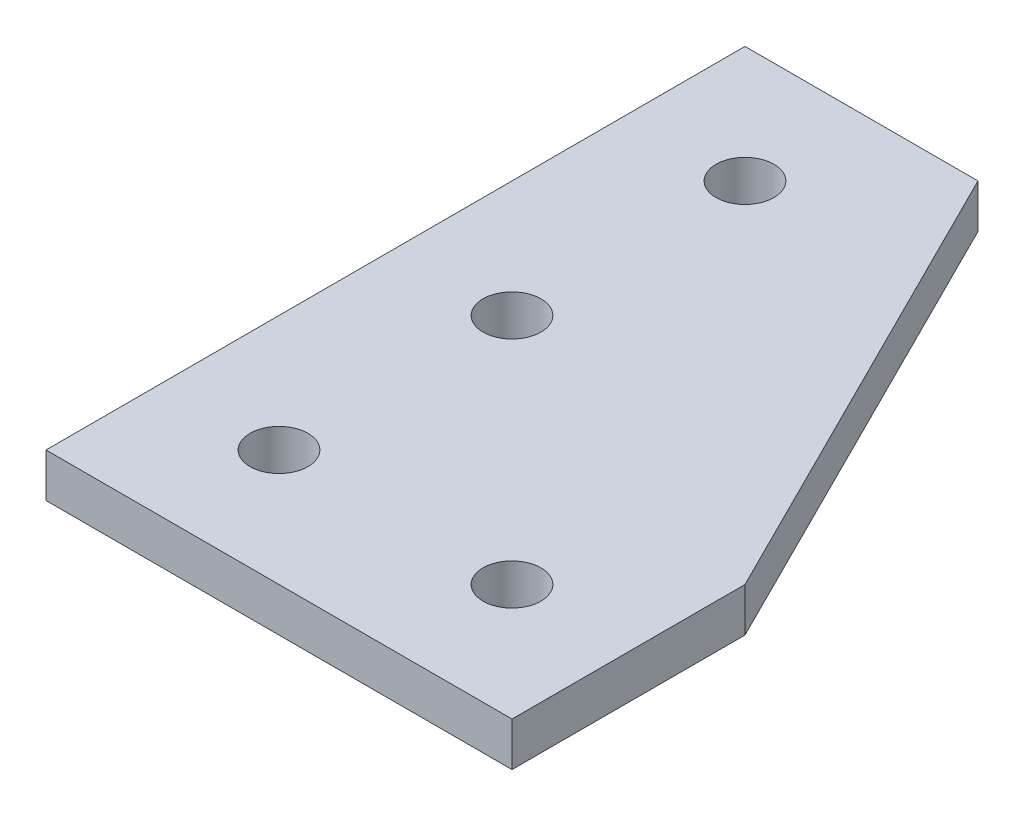
ISO-10303-21;
HEADER;
FILE_DESCRIPTION(('STEP AP214'),'2;1');
FILE_NAME('part.step','',(''),(''),'','','');
FILE_SCHEMA(('AUTOMOTIVE_DESIGN { 1 0 10303 214 1 1 1 1 }'));
ENDSEC;
DATA;
#1=APPLICATION_CONTEXT('core data for automotive mechanical design processes');
#2=APPLICATION_PROTOCOL_DEFINITION('international standard','automotive_design',2000,#1);
#3=PRODUCT_CONTEXT('',#1,'mechanical');
#4=PRODUCT('Part','Part','',(#3));
#5=PRODUCT_RELATED_PRODUCT_CATEGORY('part','',(#4));
#6=PRODUCT_DEFINITION_FORMATION('','',#4);
#7=PRODUCT_DEFINITION_CONTEXT('part definition',#1,'design');
#8=PRODUCT_DEFINITION('design','',#6,#7);
#9=PRODUCT_DEFINITION_SHAPE('','',#8);
#10=(LENGTH_UNIT() NAMED_UNIT(*) SI_UNIT(.MILLI.,.METRE.));
#11=(NAMED_UNIT(*) PLANE_ANGLE_UNIT() SI_UNIT($,.RADIAN.));
#12=(NAMED_UNIT(*) SI_UNIT($,.STERADIAN.) SOLID_ANGLE_UNIT());
#13=UNCERTAINTY_MEASURE_WITH_UNIT(LENGTH_MEASURE(1.E-05),#10,'distance_accuracy_value','');
#14=(GEOMETRIC_REPRESENTATION_CONTEXT(3) GLOBAL_UNCERTAINTY_ASSIGNED_CONTEXT((#13)) GLOBAL_UNIT_ASSIGNED_CONTEXT((#10,
#11,#12)) REPRESENTATION_CONTEXT('',''));
#15=CARTESIAN_POINT('',(0.,0.,0.));
#16=DIRECTION('',(0.,0.,1.));
#17=DIRECTION('',(1.,0.,0.));
#18=AXIS2_PLACEMENT_3D('',#15,#16,#17);
#19=CARTESIAN_POINT('',(25.4,-2.3876,38.1));
#20=DIRECTION('',(-1.,0.,0.));
#21=DIRECTION('',(0.,0.,1.));
#22=AXIS2_PLACEMENT_3D('',#19,#20,#21);
#23=PLANE('',#22);
#24=DIRECTION('',(0.,0.,-1.));
#25=VECTOR('',#24,1.);
#26=CARTESIAN_POINT('',(25.4,-2.3876,38.1));
#27=LINE('',#26,#25);
#28=CARTESIAN_POINT('',(25.4,-2.3876,38.1));
#29=VERTEX_POINT('',#28);
#30=CARTESIAN_POINT('',(25.4,-2.3876,12.7));
#31=VERTEX_POINT('',#30);
#32=EDGE_CURVE('E116',#29,#31,#27,.T.);
#33=ORIENTED_EDGE('',*,*,#32,.T.);
#34=DIRECTION('',(0.,1.,0.));
#35=VECTOR('',#34,1.);
#36=CARTESIAN_POINT('',(25.4,-5.2324,12.7));
#37=LINE('',#36,#35);
#38=CARTESIAN_POINT('',(25.4,2.3876,12.7));
#39=VERTEX_POINT('',#38);
#40=EDGE_CURVE('E103',#31,#39,#37,.T.);
#41=ORIENTED_EDGE('',*,*,#40,.T.);
#42=DIRECTION('',(0.,0.,-1.));
#43=VECTOR('',#42,1.);
#44=CARTESIAN_POINT('',(25.4,2.3876,38.1));
#45=LINE('',#44,#43);
#46=CARTESIAN_POINT('',(25.4,2.3876,38.1));
#47=VERTEX_POINT('',#46);
#48=EDGE_CURVE('E97',#47,#39,#45,.T.);
#49=ORIENTED_EDGE('',*,*,#48,.F.);
#50=DIRECTION('',(0.,1.,0.));
#51=VECTOR('',#50,1.);
#52=CARTESIAN_POINT('',(25.4,-2.3876,38.1));
#53=LINE('',#52,#51);
#54=EDGE_CURVE('E115',#29,#47,#53,.T.);
#55=ORIENTED_EDGE('',*,*,#54,.F.);
#56=EDGE_LOOP('',(#33,#41,#49,#55));
#57=FACE_BOUND('',#56,.T.);
#58=ADVANCED_FACE('F32',(#57),#23,.F.);
#59=CARTESIAN_POINT('',(-25.4,2.3876,38.1));
#60=DIRECTION('',(0.,-1.,0.));
#61=DIRECTION('',(0.,0.,-1.));
#62=AXIS2_PLACEMENT_3D('',#59,#60,#61);
#63=PLANE('',#62);
#64=CARTESIAN_POINT('',(-12.7,2.3876,0.));
#65=DIRECTION('',(0.,1.,0.));
#66=DIRECTION('',(0.,0.,1.));
#67=AXIS2_PLACEMENT_3D('',#64,#65,#66);
#68=CIRCLE('',#67,3.15188215806117);
#69=CARTESIAN_POINT('',(-12.7,2.3876,3.15188215806117));
#70=VERTEX_POINT('',#69);
#71=EDGE_CURVE('E189',#70,#70,#68,.T.);
#72=ORIENTED_EDGE('',*,*,#71,.F.);
#73=EDGE_LOOP('',(#72));
#74=FACE_BOUND('',#73,.T.);
#75=CARTESIAN_POINT('',(-12.7,2.3876,-25.4));
#76=DIRECTION('',(0.,1.,0.));
#77=DIRECTION('',(0.,0.,1.));
#78=AXIS2_PLACEMENT_3D('',#75,#76,#77);
#79=CIRCLE('',#78,3.15188215806117);
#80=CARTESIAN_POINT('',(-12.7,2.3876,-22.2481178419388));
#81=VERTEX_POINT('',#80);
#82=EDGE_CURVE('E188',#81,#81,#79,.T.);
#83=ORIENTED_EDGE('',*,*,#82,.F.);
#84=EDGE_LOOP('',(#83));
#85=FACE_BOUND('',#84,.T.);
#86=ORIENTED_EDGE('',*,*,#48,.T.);
#87=DIRECTION('',(0.447213595499958,0.,0.894427190999916));
#88=VECTOR('',#87,1.);
#89=CARTESIAN_POINT('',(0.,2.3876,-38.1));
#90=LINE('',#89,#88);
#91=CARTESIAN_POINT('',(0.,2.3876,-38.1));
#92=VERTEX_POINT('',#91);
#93=EDGE_CURVE('E90',#92,#39,#90,.T.);
#94=ORIENTED_EDGE('',*,*,#93,.F.);
#95=DIRECTION('',(-1.,0.,0.));
#96=VECTOR('',#95,1.);
#97=CARTESIAN_POINT('',(-25.4,2.3876,-38.1));
#98=LINE('',#97,#96);
#99=CARTESIAN_POINT('',(-25.4,2.3876,-38.1));
#100=VERTEX_POINT('',#99);
#101=EDGE_CURVE('E101',#92,#100,#98,.T.);
#102=ORIENTED_EDGE('',*,*,#101,.T.);
#103=DIRECTION('',(0.,0.,-1.));
#104=VECTOR('',#103,1.);
#105=CARTESIAN_POINT('',(-25.4,2.3876,38.1));
#106=LINE('',#105,#104);
#107=CARTESIAN_POINT('',(-25.4,2.3876,38.1));
#108=VERTEX_POINT('',#107);
#109=EDGE_CURVE('E121',#108,#100,#106,.T.);
#110=ORIENTED_EDGE('',*,*,#109,.F.);
#111=DIRECTION('',(-1.,0.,0.));
#112=VECTOR('',#111,1.);
#113=CARTESIAN_POINT('',(-25.4,2.3876,38.1));
#114=LINE('',#113,#112);
#115=EDGE_CURVE('E80',#47,#108,#114,.T.);
#116=ORIENTED_EDGE('',*,*,#115,.F.);
#117=EDGE_LOOP('',(#86,#94,#102,#110,#116));
#118=FACE_BOUND('',#117,.T.);
#119=CARTESIAN_POINT('',(-12.7,2.3876,25.4));
#120=DIRECTION('',(0.,1.,0.));
#121=DIRECTION('',(0.,0.,1.));
#122=AXIS2_PLACEMENT_3D('',#119,#120,#121);
#123=CIRCLE('',#122,3.15188215806117);
#124=CARTESIAN_POINT('',(-12.7,2.3876,28.5518821580612));
#125=VERTEX_POINT('',#124);
#126=EDGE_CURVE('E126',#125,#125,#123,.T.);
#127=ORIENTED_EDGE('',*,*,#126,.F.);
#128=EDGE_LOOP('',(#127));
#129=FACE_BOUND('',#128,.T.);
#130=CARTESIAN_POINT('',(12.7,2.3876,25.4));
#131=DIRECTION('',(0.,1.,0.));
#132=DIRECTION('',(0.,0.,1.));
#133=AXIS2_PLACEMENT_3D('',#130,#131,#132);
#134=CIRCLE('',#133,3.15188215806117);
#135=CARTESIAN_POINT('',(12.7,2.3876,28.5518821580612));
#136=VERTEX_POINT('',#135);
#137=EDGE_CURVE('E11',#136,#136,#134,.T.);
#138=ORIENTED_EDGE('',*,*,#137,.F.);
#139=EDGE_LOOP('',(#138));
#140=FACE_BOUND('',#139,.T.);
#141=ADVANCED_FACE('F99',(#74,#85,#118,#129,#140),#63,.F.);
#142=CARTESIAN_POINT('',(-25.4,-2.3876,38.1));
#143=DIRECTION('',(1.,0.,0.));
#144=DIRECTION('',(0.,0.,-1.));
#145=AXIS2_PLACEMENT_3D('',#142,#143,#144);
#146=PLANE('',#145);
#147=DIRECTION('',(0.,-1.,0.));
#148=VECTOR('',#147,1.);
#149=CARTESIAN_POINT('',(-25.4,-2.3876,-38.1));
#150=LINE('',#149,#148);
#151=CARTESIAN_POINT('',(-25.4,-2.3876,-38.1));
#152=VERTEX_POINT('',#151);
#153=EDGE_CURVE('E72',#100,#152,#150,.T.);
#154=ORIENTED_EDGE('',*,*,#153,.T.);
#155=DIRECTION('',(0.,0.,-1.));
#156=VECTOR('',#155,1.);
#157=CARTESIAN_POINT('',(-25.4,-2.3876,38.1));
#158=LINE('',#157,#156);
#159=CARTESIAN_POINT('',(-25.4,-2.3876,38.1));
#160=VERTEX_POINT('',#159);
#161=EDGE_CURVE('E119',#160,#152,#158,.T.);
#162=ORIENTED_EDGE('',*,*,#161,.F.);
#163=DIRECTION('',(0.,-1.,0.));
#164=VECTOR('',#163,1.);
#165=CARTESIAN_POINT('',(-25.4,-2.3876,38.1));
#166=LINE('',#165,#164);
#167=EDGE_CURVE('E198',#108,#160,#166,.T.);
#168=ORIENTED_EDGE('',*,*,#167,.F.);
#169=ORIENTED_EDGE('',*,*,#109,.T.);
#170=EDGE_LOOP('',(#154,#162,#168,#169));
#171=FACE_BOUND('',#170,.T.);
#172=ADVANCED_FACE('F139',(#171),#146,.F.);
#173=CARTESIAN_POINT('',(-25.4,-2.3876,38.1));
#174=DIRECTION('',(0.,1.,0.));
#175=DIRECTION('',(0.,0.,1.));
#176=AXIS2_PLACEMENT_3D('',#173,#174,#175);
#177=PLANE('',#176);
#178=CARTESIAN_POINT('',(-12.7,-2.3876,0.));
#179=DIRECTION('',(0.,1.,0.));
#180=DIRECTION('',(0.,0.,1.));
#181=AXIS2_PLACEMENT_3D('',#178,#179,#180);
#182=CIRCLE('',#181,3.15188215806117);
#183=CARTESIAN_POINT('',(-12.7,-2.3876,3.15188215806117));
#184=VERTEX_POINT('',#183);
#185=EDGE_CURVE('E193',#184,#184,#182,.T.);
#186=ORIENTED_EDGE('',*,*,#185,.T.);
#187=EDGE_LOOP('',(#186));
#188=FACE_BOUND('',#187,.T.);
#189=CARTESIAN_POINT('',(-12.7,-2.3876,-25.4));
#190=DIRECTION('',(0.,1.,0.));
#191=DIRECTION('',(0.,0.,1.));
#192=AXIS2_PLACEMENT_3D('',#189,#190,#191);
#193=CIRCLE('',#192,3.15188215806117);
#194=CARTESIAN_POINT('',(-12.7,-2.3876,-22.2481178419388));
#195=VERTEX_POINT('',#194);
#196=EDGE_CURVE('E104',#195,#195,#193,.T.);
#197=ORIENTED_EDGE('',*,*,#196,.T.);
#198=EDGE_LOOP('',(#197));
#199=FACE_BOUND('',#198,.T.);
#200=DIRECTION('',(1.,0.,0.));
#201=VECTOR('',#200,1.);
#202=CARTESIAN_POINT('',(-25.4,-2.3876,-38.1));
#203=LINE('',#202,#201);
#204=CARTESIAN_POINT('',(0.,-2.3876,-38.1));
#205=VERTEX_POINT('',#204);
#206=EDGE_CURVE('E108',#152,#205,#203,.T.);
#207=ORIENTED_EDGE('',*,*,#206,.T.);
#208=DIRECTION('',(0.447213595499958,0.,0.894427190999916));
#209=VECTOR('',#208,1.);
#210=CARTESIAN_POINT('',(25.4,-2.3876,12.7));
#211=LINE('',#210,#209);
#212=EDGE_CURVE('E47',#205,#31,#211,.T.);
#213=ORIENTED_EDGE('',*,*,#212,.T.);
#214=ORIENTED_EDGE('',*,*,#32,.F.);
#215=DIRECTION('',(1.,0.,0.));
#216=VECTOR('',#215,1.);
#217=CARTESIAN_POINT('',(-25.4,-2.3876,38.1));
#218=LINE('',#217,#216);
#219=EDGE_CURVE('E56',#160,#29,#218,.T.);
#220=ORIENTED_EDGE('',*,*,#219,.F.);
#221=ORIENTED_EDGE('',*,*,#161,.T.);
#222=EDGE_LOOP('',(#207,#213,#214,#220,#221));
#223=FACE_BOUND('',#222,.T.);
#224=CARTESIAN_POINT('',(-12.7,-2.3876,25.4));
#225=DIRECTION('',(0.,1.,0.));
#226=DIRECTION('',(0.,0.,1.));
#227=AXIS2_PLACEMENT_3D('',#224,#225,#226);
#228=CIRCLE('',#227,3.15188215806117);
#229=CARTESIAN_POINT('',(-12.7,-2.3876,28.5518821580612));
#230=VERTEX_POINT('',#229);
#231=EDGE_CURVE('E96',#230,#230,#228,.T.);
#232=ORIENTED_EDGE('',*,*,#231,.T.);
#233=EDGE_LOOP('',(#232));
#234=FACE_BOUND('',#233,.T.);
#235=CARTESIAN_POINT('',(12.7,-2.3876,25.4));
#236=DIRECTION('',(0.,1.,0.));
#237=DIRECTION('',(0.,0.,1.));
#238=AXIS2_PLACEMENT_3D('',#235,#236,#237);
#239=CIRCLE('',#238,3.15188215806117);
#240=CARTESIAN_POINT('',(12.7,-2.3876,28.5518821580612));
#241=VERTEX_POINT('',#240);
#242=EDGE_CURVE('E40',#241,#241,#239,.T.);
#243=ORIENTED_EDGE('',*,*,#242,.T.);
#244=EDGE_LOOP('',(#243));
#245=FACE_BOUND('',#244,.T.);
#246=ADVANCED_FACE('F131',(#188,#199,#223,#234,#245),#177,.F.);
#247=CARTESIAN_POINT('',(25.4,2.3876,38.1));
#248=DIRECTION('',(0.,0.,-1.));
#249=DIRECTION('',(-1.,0.,0.));
#250=AXIS2_PLACEMENT_3D('',#247,#248,#249);
#251=PLANE('',#250);
#252=ORIENTED_EDGE('',*,*,#54,.T.);
#253=ORIENTED_EDGE('',*,*,#115,.T.);
#254=ORIENTED_EDGE('',*,*,#167,.T.);
#255=ORIENTED_EDGE('',*,*,#219,.T.);
#256=EDGE_LOOP('',(#252,#253,#254,#255));
#257=FACE_BOUND('',#256,.T.);
#258=ADVANCED_FACE('F166',(#257),#251,.F.);
#259=CARTESIAN_POINT('',(25.4,2.3876,-38.1));
#260=DIRECTION('',(0.,0.,-1.));
#261=DIRECTION('',(-1.,0.,0.));
#262=AXIS2_PLACEMENT_3D('',#259,#260,#261);
#263=PLANE('',#262);
#264=DIRECTION('',(0.,1.,0.));
#265=VECTOR('',#264,1.);
#266=CARTESIAN_POINT('',(0.,2.3876,-38.1));
#267=LINE('',#266,#265);
#268=EDGE_CURVE('E87',#205,#92,#267,.T.);
#269=ORIENTED_EDGE('',*,*,#268,.F.);
#270=ORIENTED_EDGE('',*,*,#206,.F.);
#271=ORIENTED_EDGE('',*,*,#153,.F.);
#272=ORIENTED_EDGE('',*,*,#101,.F.);
#273=EDGE_LOOP('',(#269,#270,#271,#272));
#274=FACE_BOUND('',#273,.T.);
#275=ADVANCED_FACE('F106',(#274),#263,.T.);
#276=CARTESIAN_POINT('',(0.,-5.2324,-38.1));
#277=DIRECTION('',(-0.894427190999916,0.,0.447213595499958));
#278=DIRECTION('',(0.447213595499958,0.,0.894427190999916));
#279=AXIS2_PLACEMENT_3D('',#276,#277,#278);
#280=PLANE('',#279);
#281=ORIENTED_EDGE('',*,*,#268,.T.);
#282=ORIENTED_EDGE('',*,*,#93,.T.);
#283=ORIENTED_EDGE('',*,*,#40,.F.);
#284=ORIENTED_EDGE('',*,*,#212,.F.);
#285=EDGE_LOOP('',(#281,#282,#283,#284));
#286=FACE_BOUND('',#285,.T.);
#287=ADVANCED_FACE('F89',(#286),#280,.F.);
#288=CARTESIAN_POINT('',(-12.7,-2.3876,-25.4));
#289=DIRECTION('',(0.,1.,0.));
#290=DIRECTION('',(0.,0.,1.));
#291=AXIS2_PLACEMENT_3D('',#288,#289,#290);
#292=CYLINDRICAL_SURFACE('',#291,3.15188215806117);
#293=ORIENTED_EDGE('',*,*,#196,.F.);
#294=EDGE_LOOP('',(#293));
#295=FACE_BOUND('',#294,.T.);
#296=ORIENTED_EDGE('',*,*,#82,.T.);
#297=EDGE_LOOP('',(#296));
#298=FACE_BOUND('',#297,.T.);
#299=ADVANCED_FACE('F158',(#295,#298),#292,.F.);
#300=CARTESIAN_POINT('',(-12.7,-2.3876,0.));
#301=DIRECTION('',(0.,1.,0.));
#302=DIRECTION('',(0.,0.,1.));
#303=AXIS2_PLACEMENT_3D('',#300,#301,#302);
#304=CYLINDRICAL_SURFACE('',#303,3.15188215806117);
#305=ORIENTED_EDGE('',*,*,#185,.F.);
#306=EDGE_LOOP('',(#305));
#307=FACE_BOUND('',#306,.T.);
#308=ORIENTED_EDGE('',*,*,#71,.T.);
#309=EDGE_LOOP('',(#308));
#310=FACE_BOUND('',#309,.T.);
#311=ADVANCED_FACE('F153',(#307,#310),#304,.F.);
#312=CARTESIAN_POINT('',(-12.7,-2.3876,25.4));
#313=DIRECTION('',(0.,1.,0.));
#314=DIRECTION('',(0.,0.,1.));
#315=AXIS2_PLACEMENT_3D('',#312,#313,#314);
#316=CYLINDRICAL_SURFACE('',#315,3.15188215806117);
#317=ORIENTED_EDGE('',*,*,#231,.F.);
#318=EDGE_LOOP('',(#317));
#319=FACE_BOUND('',#318,.T.);
#320=ORIENTED_EDGE('',*,*,#126,.T.);
#321=EDGE_LOOP('',(#320));
#322=FACE_BOUND('',#321,.T.);
#323=ADVANCED_FACE('F135',(#319,#322),#316,.F.);
#324=CARTESIAN_POINT('',(12.7,-2.3876,25.4));
#325=DIRECTION('',(0.,1.,0.));
#326=DIRECTION('',(0.,0.,1.));
#327=AXIS2_PLACEMENT_3D('',#324,#325,#326);
#328=CYLINDRICAL_SURFACE('',#327,3.15188215806117);
#329=ORIENTED_EDGE('',*,*,#242,.F.);
#330=EDGE_LOOP('',(#329));
#331=FACE_BOUND('',#330,.T.);
#332=ORIENTED_EDGE('',*,*,#137,.T.);
#333=EDGE_LOOP('',(#332));
#334=FACE_BOUND('',#333,.T.);
#335=ADVANCED_FACE('F34',(#331,#334),#328,.F.);
#336=CLOSED_SHELL('',(#58,#141,#172,#246,#258,#275,#287,#299,#311,#323,#335));
#337=MANIFOLD_SOLID_BREP('B2',#336);
#338=ADVANCED_BREP_SHAPE_REPRESENTATION('',(#18,#337),#14);
#339=SHAPE_DEFINITION_REPRESENTATION(#9,#338);
ENDSEC;
END-ISO-10303-21;
